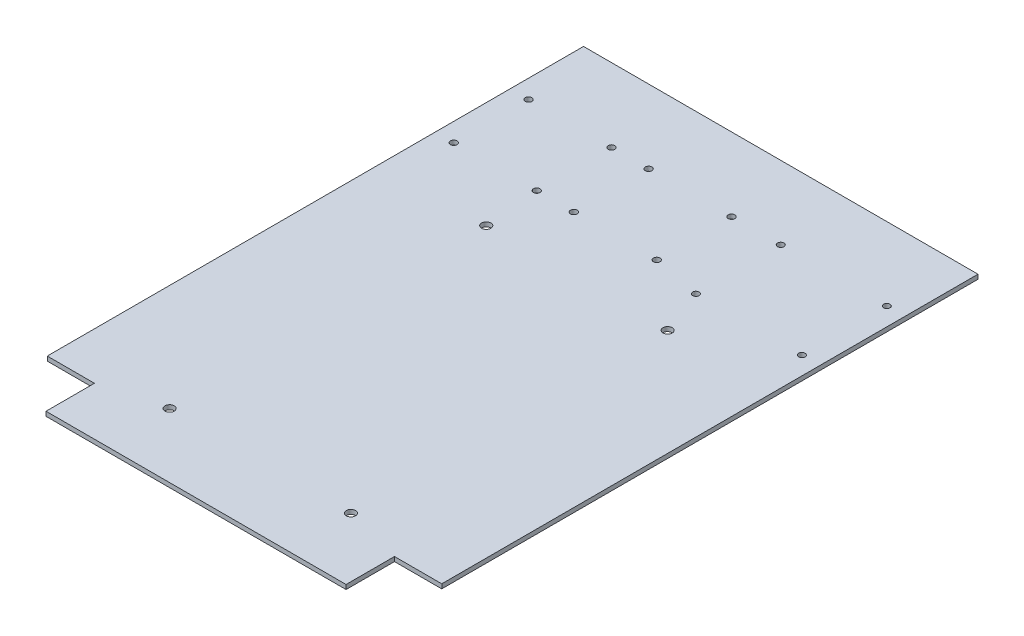
ISO-10303-21;
HEADER;
FILE_DESCRIPTION(('STEP AP214'),'2;1');
FILE_NAME('part.step','',(''),(''),'','','');
FILE_SCHEMA(('AUTOMOTIVE_DESIGN { 1 0 10303 214 1 1 1 1 }'));
ENDSEC;
DATA;
#1=APPLICATION_CONTEXT('core data for automotive mechanical design processes');
#2=APPLICATION_PROTOCOL_DEFINITION('international standard','automotive_design',2000,#1);
#3=PRODUCT_CONTEXT('',#1,'mechanical');
#4=PRODUCT('Part','Part','',(#3));
#5=PRODUCT_RELATED_PRODUCT_CATEGORY('part','',(#4));
#6=PRODUCT_DEFINITION_FORMATION('','',#4);
#7=PRODUCT_DEFINITION_CONTEXT('part definition',#1,'design');
#8=PRODUCT_DEFINITION('design','',#6,#7);
#9=PRODUCT_DEFINITION_SHAPE('','',#8);
#10=(LENGTH_UNIT() NAMED_UNIT(*) SI_UNIT(.MILLI.,.METRE.));
#11=(NAMED_UNIT(*) PLANE_ANGLE_UNIT() SI_UNIT($,.RADIAN.));
#12=(NAMED_UNIT(*) SI_UNIT($,.STERADIAN.) SOLID_ANGLE_UNIT());
#13=UNCERTAINTY_MEASURE_WITH_UNIT(LENGTH_MEASURE(1.E-05),#10,'distance_accuracy_value','');
#14=(GEOMETRIC_REPRESENTATION_CONTEXT(3) GLOBAL_UNCERTAINTY_ASSIGNED_CONTEXT((#13)) GLOBAL_UNIT_ASSIGNED_CONTEXT((#10,
#11,#12)) REPRESENTATION_CONTEXT('',''));
#15=CARTESIAN_POINT('',(0.,0.,0.));
#16=DIRECTION('',(0.,0.,1.));
#17=DIRECTION('',(1.,0.,0.));
#18=AXIS2_PLACEMENT_3D('',#15,#16,#17);
#19=CARTESIAN_POINT('',(-113.538,2.54,176.2125));
#20=DIRECTION('',(1.,0.,0.));
#21=DIRECTION('',(0.,0.,-1.));
#22=AXIS2_PLACEMENT_3D('',#19,#20,#21);
#23=PLANE('',#22);
#24=DIRECTION('',(0.,0.,1.));
#25=VECTOR('',#24,1.);
#26=CARTESIAN_POINT('',(-113.538,0.,176.2125));
#27=LINE('',#26,#25);
#28=CARTESIAN_POINT('',(-113.538,0.,-176.2125));
#29=VERTEX_POINT('',#28);
#30=CARTESIAN_POINT('',(-113.538,0.,132.460999999996));
#31=VERTEX_POINT('',#30);
#32=EDGE_CURVE('E256',#29,#31,#27,.T.);
#33=ORIENTED_EDGE('',*,*,#32,.T.);
#34=DIRECTION('',(0.,1.,0.));
#35=VECTOR('',#34,1.);
#36=CARTESIAN_POINT('',(-113.538,2.54,132.460999999996));
#37=LINE('',#36,#35);
#38=CARTESIAN_POINT('',(-113.538,2.54,132.460999999996));
#39=VERTEX_POINT('',#38);
#40=EDGE_CURVE('E251',#31,#39,#37,.T.);
#41=ORIENTED_EDGE('',*,*,#40,.T.);
#42=DIRECTION('',(0.,0.,1.));
#43=VECTOR('',#42,1.);
#44=CARTESIAN_POINT('',(-113.538,2.54,176.2125));
#45=LINE('',#44,#43);
#46=CARTESIAN_POINT('',(-113.538,2.54,-176.2125));
#47=VERTEX_POINT('',#46);
#48=EDGE_CURVE('E257',#47,#39,#45,.T.);
#49=ORIENTED_EDGE('',*,*,#48,.F.);
#50=DIRECTION('',(0.,-1.,0.));
#51=VECTOR('',#50,1.);
#52=CARTESIAN_POINT('',(-113.538,2.54,-176.2125));
#53=LINE('',#52,#51);
#54=EDGE_CURVE('E267',#47,#29,#53,.T.);
#55=ORIENTED_EDGE('',*,*,#54,.T.);
#56=EDGE_LOOP('',(#33,#41,#49,#55));
#57=FACE_BOUND('',#56,.T.);
#58=ADVANCED_FACE('F43',(#57),#23,.F.);
#59=CARTESIAN_POINT('',(113.538,2.54,176.2125));
#60=DIRECTION('',(-1.,0.,0.));
#61=DIRECTION('',(0.,0.,1.));
#62=AXIS2_PLACEMENT_3D('',#59,#60,#61);
#63=PLANE('',#62);
#64=DIRECTION('',(0.,0.,-1.));
#65=VECTOR('',#64,1.);
#66=CARTESIAN_POINT('',(113.538,2.54,176.2125));
#67=LINE('',#66,#65);
#68=CARTESIAN_POINT('',(113.538,2.54,132.460999999996));
#69=VERTEX_POINT('',#68);
#70=CARTESIAN_POINT('',(113.538,2.54,-176.2125));
#71=VERTEX_POINT('',#70);
#72=EDGE_CURVE('E261',#69,#71,#67,.T.);
#73=ORIENTED_EDGE('',*,*,#72,.F.);
#74=DIRECTION('',(0.,-1.,0.));
#75=VECTOR('',#74,1.);
#76=CARTESIAN_POINT('',(113.538,2.54,132.460999999996));
#77=LINE('',#76,#75);
#78=CARTESIAN_POINT('',(113.538,0.,132.460999999996));
#79=VERTEX_POINT('',#78);
#80=EDGE_CURVE('E114',#69,#79,#77,.T.);
#81=ORIENTED_EDGE('',*,*,#80,.T.);
#82=DIRECTION('',(0.,0.,-1.));
#83=VECTOR('',#82,1.);
#84=CARTESIAN_POINT('',(113.538,0.,176.2125));
#85=LINE('',#84,#83);
#86=CARTESIAN_POINT('',(113.538,0.,-176.2125));
#87=VERTEX_POINT('',#86);
#88=EDGE_CURVE('E125',#79,#87,#85,.T.);
#89=ORIENTED_EDGE('',*,*,#88,.T.);
#90=DIRECTION('',(0.,-1.,0.));
#91=VECTOR('',#90,1.);
#92=CARTESIAN_POINT('',(113.538,2.54,-176.2125));
#93=LINE('',#92,#91);
#94=EDGE_CURVE('E277',#71,#87,#93,.T.);
#95=ORIENTED_EDGE('',*,*,#94,.F.);
#96=EDGE_LOOP('',(#73,#81,#89,#95));
#97=FACE_BOUND('',#96,.T.);
#98=ADVANCED_FACE('F311',(#97),#63,.F.);
#99=CARTESIAN_POINT('',(113.538,2.54,-176.2125));
#100=DIRECTION('',(0.,0.,1.));
#101=DIRECTION('',(1.,0.,0.));
#102=AXIS2_PLACEMENT_3D('',#99,#100,#101);
#103=PLANE('',#102);
#104=DIRECTION('',(-1.,0.,0.));
#105=VECTOR('',#104,1.);
#106=CARTESIAN_POINT('',(113.538,0.,-176.2125));
#107=LINE('',#106,#105);
#108=EDGE_CURVE('E262',#87,#29,#107,.T.);
#109=ORIENTED_EDGE('',*,*,#108,.T.);
#110=ORIENTED_EDGE('',*,*,#54,.F.);
#111=DIRECTION('',(-1.,0.,0.));
#112=VECTOR('',#111,1.);
#113=CARTESIAN_POINT('',(113.538,2.54,-176.2125));
#114=LINE('',#113,#112);
#115=EDGE_CURVE('E265',#71,#47,#114,.T.);
#116=ORIENTED_EDGE('',*,*,#115,.F.);
#117=ORIENTED_EDGE('',*,*,#94,.T.);
#118=EDGE_LOOP('',(#109,#110,#116,#117));
#119=FACE_BOUND('',#118,.T.);
#120=ADVANCED_FACE('F315',(#119),#103,.F.);
#121=CARTESIAN_POINT('',(0.,2.54,0.));
#122=DIRECTION('',(0.,1.,0.));
#123=DIRECTION('',(0.,0.,1.));
#124=AXIS2_PLACEMENT_3D('',#121,#122,#123);
#125=PLANE('',#124);
#126=DIRECTION('',(0.,0.,1.));
#127=VECTOR('',#126,1.);
#128=CARTESIAN_POINT('',(86.3345999997772,2.54,173.505706146315));
#129=LINE('',#128,#127);
#130=CARTESIAN_POINT('',(86.3345999997772,2.54,132.460999999996));
#131=VERTEX_POINT('',#130);
#132=CARTESIAN_POINT('',(86.3345999997772,2.54,160.3375));
#133=VERTEX_POINT('',#132);
#134=EDGE_CURVE('E57',#131,#133,#129,.T.);
#135=ORIENTED_EDGE('',*,*,#134,.F.);
#136=DIRECTION('',(-1.,0.,0.));
#137=VECTOR('',#136,1.);
#138=CARTESIAN_POINT('',(116.814599999777,2.54,132.460999999996));
#139=LINE('',#138,#137);
#140=EDGE_CURVE('E113',#69,#131,#139,.T.);
#141=ORIENTED_EDGE('',*,*,#140,.F.);
#142=ORIENTED_EDGE('',*,*,#72,.T.);
#143=ORIENTED_EDGE('',*,*,#115,.T.);
#144=ORIENTED_EDGE('',*,*,#48,.T.);
#145=DIRECTION('',(-1.,0.,0.));
#146=VECTOR('',#145,1.);
#147=CARTESIAN_POINT('',(-116.865400000223,2.54,132.460999999996));
#148=LINE('',#147,#146);
#149=CARTESIAN_POINT('',(-86.3854000002228,2.54,132.460999999996));
#150=VERTEX_POINT('',#149);
#151=EDGE_CURVE('E236',#150,#39,#148,.T.);
#152=ORIENTED_EDGE('',*,*,#151,.F.);
#153=DIRECTION('',(0.,0.,-1.));
#154=VECTOR('',#153,1.);
#155=CARTESIAN_POINT('',(-86.3854000002228,2.54,132.460999999996));
#156=LINE('',#155,#154);
#157=CARTESIAN_POINT('',(-86.3854000002228,2.54,160.3375));
#158=VERTEX_POINT('',#157);
#159=EDGE_CURVE('E237',#158,#150,#156,.T.);
#160=ORIENTED_EDGE('',*,*,#159,.F.);
#161=DIRECTION('',(-1.,0.,0.));
#162=VECTOR('',#161,1.);
#163=CARTESIAN_POINT('',(0.,2.54,160.3375));
#164=LINE('',#163,#162);
#165=EDGE_CURVE('E63',#133,#158,#164,.T.);
#166=ORIENTED_EDGE('',*,*,#165,.F.);
#167=EDGE_LOOP('',(#135,#141,#142,#143,#144,#152,#160,#166));
#168=FACE_BOUND('',#167,.T.);
#169=CARTESIAN_POINT('',(-55.1204042675425,2.54,-133.922560256874));
#170=DIRECTION('',(0.,1.,0.));
#171=DIRECTION('',(0.,0.,1.));
#172=AXIS2_PLACEMENT_3D('',#169,#170,#171);
#173=CIRCLE('',#172,1.905);
#174=CARTESIAN_POINT('',(-55.1204042675425,2.54,-132.017560256874));
#175=VERTEX_POINT('',#174);
#176=EDGE_CURVE('E138',#175,#175,#173,.T.);
#177=ORIENTED_EDGE('',*,*,#176,.F.);
#178=EDGE_LOOP('',(#177));
#179=FACE_BOUND('',#178,.T.);
#180=CARTESIAN_POINT('',(-102.870050800407,2.54,-133.922560256874));
#181=DIRECTION('',(0.,1.,0.));
#182=DIRECTION('',(0.,0.,1.));
#183=AXIS2_PLACEMENT_3D('',#180,#181,#182);
#184=CIRCLE('',#183,1.905);
#185=CARTESIAN_POINT('',(-102.870050800407,2.54,-132.017560256874));
#186=VERTEX_POINT('',#185);
#187=EDGE_CURVE('E208',#186,#186,#184,.T.);
#188=ORIENTED_EDGE('',*,*,#187,.F.);
#189=EDGE_LOOP('',(#188));
#190=FACE_BOUND('',#189,.T.);
#191=CARTESIAN_POINT('',(-102.870050800407,2.54,-90.8695602568742));
#192=DIRECTION('',(0.,1.,0.));
#193=DIRECTION('',(0.,0.,1.));
#194=AXIS2_PLACEMENT_3D('',#191,#192,#193);
#195=CIRCLE('',#194,1.90500000000001);
#196=CARTESIAN_POINT('',(-102.870050800407,2.54,-88.9645602568742));
#197=VERTEX_POINT('',#196);
#198=EDGE_CURVE('E202',#197,#197,#195,.T.);
#199=ORIENTED_EDGE('',*,*,#198,.F.);
#200=EDGE_LOOP('',(#199));
#201=FACE_BOUND('',#200,.T.);
#202=CARTESIAN_POINT('',(-55.118050800407,2.54,-90.8695602568742));
#203=DIRECTION('',(0.,1.,0.));
#204=DIRECTION('',(0.,0.,1.));
#205=AXIS2_PLACEMENT_3D('',#202,#203,#204);
#206=CIRCLE('',#205,1.905);
#207=CARTESIAN_POINT('',(-55.118050800407,2.54,-88.9645602568742));
#208=VERTEX_POINT('',#207);
#209=EDGE_CURVE('E195',#208,#208,#206,.T.);
#210=ORIENTED_EDGE('',*,*,#209,.F.);
#211=EDGE_LOOP('',(#210));
#212=FACE_BOUND('',#211,.T.);
#213=CARTESIAN_POINT('',(-33.7820508004074,2.54,-133.922560256874));
#214=DIRECTION('',(0.,1.,0.));
#215=DIRECTION('',(0.,0.,1.));
#216=AXIS2_PLACEMENT_3D('',#213,#214,#215);
#217=CIRCLE('',#216,1.905);
#218=CARTESIAN_POINT('',(-33.7820508004074,2.54,-132.017560256874));
#219=VERTEX_POINT('',#218);
#220=EDGE_CURVE('E220',#219,#219,#217,.T.);
#221=ORIENTED_EDGE('',*,*,#220,.F.);
#222=EDGE_LOOP('',(#221));
#223=FACE_BOUND('',#222,.T.);
#224=CARTESIAN_POINT('',(-33.7820508004074,2.54,-90.8695602568743));
#225=DIRECTION('',(0.,1.,0.));
#226=DIRECTION('',(0.,0.,1.));
#227=AXIS2_PLACEMENT_3D('',#224,#225,#226);
#228=CIRCLE('',#227,1.905);
#229=CARTESIAN_POINT('',(-33.7820508004074,2.54,-88.9645602568743));
#230=VERTEX_POINT('',#229);
#231=EDGE_CURVE('E221',#230,#230,#228,.T.);
#232=ORIENTED_EDGE('',*,*,#231,.F.);
#233=EDGE_LOOP('',(#232));
#234=FACE_BOUND('',#233,.T.);
#235=CARTESIAN_POINT('',(13.9699491995926,2.54,-90.8695602568743));
#236=DIRECTION('',(0.,1.,0.));
#237=DIRECTION('',(0.,0.,1.));
#238=AXIS2_PLACEMENT_3D('',#235,#236,#237);
#239=CIRCLE('',#238,1.90500000000001);
#240=CARTESIAN_POINT('',(13.9699491995926,2.54,-88.9645602568743));
#241=VERTEX_POINT('',#240);
#242=EDGE_CURVE('E194',#241,#241,#239,.T.);
#243=ORIENTED_EDGE('',*,*,#242,.F.);
#244=EDGE_LOOP('',(#243));
#245=FACE_BOUND('',#244,.T.);
#246=CARTESIAN_POINT('',(42.1259507999995,2.54,-134.087660257276));
#247=DIRECTION('',(0.,1.,0.));
#248=DIRECTION('',(0.,0.,1.));
#249=AXIS2_PLACEMENT_3D('',#246,#247,#248);
#250=CIRCLE('',#249,1.83872447278816);
#251=CARTESIAN_POINT('',(42.1259507999995,2.54,-132.248935784488));
#252=VERTEX_POINT('',#251);
#253=EDGE_CURVE('E139',#252,#252,#250,.T.);
#254=ORIENTED_EDGE('',*,*,#253,.F.);
#255=EDGE_LOOP('',(#254));
#256=FACE_BOUND('',#255,.T.);
#257=CARTESIAN_POINT('',(103.162150799999,2.54,-134.087660257276));
#258=DIRECTION('',(0.,1.,0.));
#259=DIRECTION('',(0.,0.,1.));
#260=AXIS2_PLACEMENT_3D('',#257,#258,#259);
#261=CIRCLE('',#260,1.83872447278816);
#262=CARTESIAN_POINT('',(103.162150799999,2.54,-132.248935784488));
#263=VERTEX_POINT('',#262);
#264=EDGE_CURVE('E145',#263,#263,#261,.T.);
#265=ORIENTED_EDGE('',*,*,#264,.F.);
#266=EDGE_LOOP('',(#265));
#267=FACE_BOUND('',#266,.T.);
#268=CARTESIAN_POINT('',(103.162150799999,2.54,-85.2434602572759));
#269=DIRECTION('',(0.,1.,0.));
#270=DIRECTION('',(0.,0.,1.));
#271=AXIS2_PLACEMENT_3D('',#268,#269,#270);
#272=CIRCLE('',#271,1.83872447278816);
#273=CARTESIAN_POINT('',(103.162150799999,2.54,-83.4047357844877));
#274=VERTEX_POINT('',#273);
#275=EDGE_CURVE('E151',#274,#274,#272,.T.);
#276=ORIENTED_EDGE('',*,*,#275,.F.);
#277=EDGE_LOOP('',(#276));
#278=FACE_BOUND('',#277,.T.);
#279=CARTESIAN_POINT('',(42.1259507999995,2.54,-85.2434602572759));
#280=DIRECTION('',(0.,1.,0.));
#281=DIRECTION('',(0.,0.,1.));
#282=AXIS2_PLACEMENT_3D('',#279,#280,#281);
#283=CIRCLE('',#282,1.83872447278816);
#284=CARTESIAN_POINT('',(42.1259507999995,2.54,-83.4047357844877));
#285=VERTEX_POINT('',#284);
#286=EDGE_CURVE('E159',#285,#285,#283,.T.);
#287=ORIENTED_EDGE('',*,*,#286,.F.);
#288=EDGE_LOOP('',(#287));
#289=FACE_BOUND('',#288,.T.);
#290=CARTESIAN_POINT('',(52.1969999997947,2.54,-58.8853890367552));
#291=DIRECTION('',(0.,1.,0.));
#292=DIRECTION('',(0.,0.,1.));
#293=AXIS2_PLACEMENT_3D('',#290,#291,#292);
#294=CIRCLE('',#293,2.667);
#295=CARTESIAN_POINT('',(52.1969999997947,2.54,-56.2183890367552));
#296=VERTEX_POINT('',#295);
#297=EDGE_CURVE('E167',#296,#296,#294,.T.);
#298=ORIENTED_EDGE('',*,*,#297,.F.);
#299=EDGE_LOOP('',(#298));
#300=FACE_BOUND('',#299,.T.);
#301=CARTESIAN_POINT('',(-52.1970000002053,2.54,-58.8853890367553));
#302=DIRECTION('',(0.,1.,0.));
#303=DIRECTION('',(0.,0.,1.));
#304=AXIS2_PLACEMENT_3D('',#301,#302,#303);
#305=CIRCLE('',#304,2.667);
#306=CARTESIAN_POINT('',(-52.1970000002053,2.54,-56.2183890367553));
#307=VERTEX_POINT('',#306);
#308=EDGE_CURVE('E175',#307,#307,#305,.T.);
#309=ORIENTED_EDGE('',*,*,#308,.F.);
#310=EDGE_LOOP('',(#309));
#311=FACE_BOUND('',#310,.T.);
#312=CARTESIAN_POINT('',(52.1969999997946,2.54,123.385010963245));
#313=DIRECTION('',(0.,1.,0.));
#314=DIRECTION('',(0.,0.,1.));
#315=AXIS2_PLACEMENT_3D('',#312,#313,#314);
#316=CIRCLE('',#315,2.667);
#317=CARTESIAN_POINT('',(52.1969999997946,2.54,126.052010963245));
#318=VERTEX_POINT('',#317);
#319=EDGE_CURVE('E182',#318,#318,#316,.T.);
#320=ORIENTED_EDGE('',*,*,#319,.F.);
#321=EDGE_LOOP('',(#320));
#322=FACE_BOUND('',#321,.T.);
#323=CARTESIAN_POINT('',(-52.1970000002054,2.54,123.385010963245));
#324=DIRECTION('',(0.,1.,0.));
#325=DIRECTION('',(0.,0.,1.));
#326=AXIS2_PLACEMENT_3D('',#323,#324,#325);
#327=CIRCLE('',#326,2.667);
#328=CARTESIAN_POINT('',(-52.1970000002054,2.54,126.052010963245));
#329=VERTEX_POINT('',#328);
#330=EDGE_CURVE('E134',#329,#329,#327,.T.);
#331=ORIENTED_EDGE('',*,*,#330,.F.);
#332=EDGE_LOOP('',(#331));
#333=FACE_BOUND('',#332,.T.);
#334=CARTESIAN_POINT('',(13.9675957324571,2.54,-133.922560256874));
#335=DIRECTION('',(0.,1.,0.));
#336=DIRECTION('',(0.,0.,1.));
#337=AXIS2_PLACEMENT_3D('',#334,#335,#336);
#338=CIRCLE('',#337,1.90499999999999);
#339=CARTESIAN_POINT('',(13.9675957324571,2.54,-132.017560256874));
#340=VERTEX_POINT('',#339);
#341=EDGE_CURVE('E243',#340,#340,#338,.T.);
#342=ORIENTED_EDGE('',*,*,#341,.F.);
#343=EDGE_LOOP('',(#342));
#344=FACE_BOUND('',#343,.T.);
#345=ADVANCED_FACE('F288',(#168,#179,#190,#201,#212,#223,#234,#245,#256,#267,#278,#289,#300,
#311,#322,#333,#344),#125,.T.);
#346=CARTESIAN_POINT('',(0.,0.,0.));
#347=DIRECTION('',(0.,1.,0.));
#348=DIRECTION('',(0.,0.,1.));
#349=AXIS2_PLACEMENT_3D('',#346,#347,#348);
#350=PLANE('',#349);
#351=CARTESIAN_POINT('',(-55.1204042675425,0.,-133.922560256874));
#352=DIRECTION('',(0.,1.,0.));
#353=DIRECTION('',(0.,0.,1.));
#354=AXIS2_PLACEMENT_3D('',#351,#352,#353);
#355=CIRCLE('',#354,1.905);
#356=CARTESIAN_POINT('',(-55.1204042675425,0.,-132.017560256874));
#357=VERTEX_POINT('',#356);
#358=EDGE_CURVE('E211',#357,#357,#355,.T.);
#359=ORIENTED_EDGE('',*,*,#358,.T.);
#360=EDGE_LOOP('',(#359));
#361=FACE_BOUND('',#360,.T.);
#362=CARTESIAN_POINT('',(-102.870050800407,0.,-133.922560256874));
#363=DIRECTION('',(0.,1.,0.));
#364=DIRECTION('',(0.,0.,1.));
#365=AXIS2_PLACEMENT_3D('',#362,#363,#364);
#366=CIRCLE('',#365,1.905);
#367=CARTESIAN_POINT('',(-102.870050800407,0.,-132.017560256874));
#368=VERTEX_POINT('',#367);
#369=EDGE_CURVE('E205',#368,#368,#366,.T.);
#370=ORIENTED_EDGE('',*,*,#369,.T.);
#371=EDGE_LOOP('',(#370));
#372=FACE_BOUND('',#371,.T.);
#373=CARTESIAN_POINT('',(-102.870050800407,0.,-90.8695602568742));
#374=DIRECTION('',(0.,1.,0.));
#375=DIRECTION('',(0.,0.,1.));
#376=AXIS2_PLACEMENT_3D('',#373,#374,#375);
#377=CIRCLE('',#376,1.90500000000001);
#378=CARTESIAN_POINT('',(-102.870050800407,0.,-88.9645602568742));
#379=VERTEX_POINT('',#378);
#380=EDGE_CURVE('E199',#379,#379,#377,.T.);
#381=ORIENTED_EDGE('',*,*,#380,.T.);
#382=EDGE_LOOP('',(#381));
#383=FACE_BOUND('',#382,.T.);
#384=CARTESIAN_POINT('',(-55.118050800407,0.,-90.8695602568742));
#385=DIRECTION('',(0.,1.,0.));
#386=DIRECTION('',(0.,0.,1.));
#387=AXIS2_PLACEMENT_3D('',#384,#385,#386);
#388=CIRCLE('',#387,1.905);
#389=CARTESIAN_POINT('',(-55.118050800407,0.,-88.9645602568742));
#390=VERTEX_POINT('',#389);
#391=EDGE_CURVE('E190',#390,#390,#388,.T.);
#392=ORIENTED_EDGE('',*,*,#391,.T.);
#393=EDGE_LOOP('',(#392));
#394=FACE_BOUND('',#393,.T.);
#395=CARTESIAN_POINT('',(-33.7820508004074,0.,-133.922560256874));
#396=DIRECTION('',(0.,1.,0.));
#397=DIRECTION('',(0.,0.,1.));
#398=AXIS2_PLACEMENT_3D('',#395,#396,#397);
#399=CIRCLE('',#398,1.905);
#400=CARTESIAN_POINT('',(-33.7820508004074,0.,-132.017560256874));
#401=VERTEX_POINT('',#400);
#402=EDGE_CURVE('E239',#401,#401,#399,.T.);
#403=ORIENTED_EDGE('',*,*,#402,.T.);
#404=EDGE_LOOP('',(#403));
#405=FACE_BOUND('',#404,.T.);
#406=CARTESIAN_POINT('',(-33.7820508004074,0.,-90.8695602568743));
#407=DIRECTION('',(0.,1.,0.));
#408=DIRECTION('',(0.,0.,1.));
#409=AXIS2_PLACEMENT_3D('',#406,#407,#408);
#410=CIRCLE('',#409,1.905);
#411=CARTESIAN_POINT('',(-33.7820508004074,0.,-88.9645602568743));
#412=VERTEX_POINT('',#411);
#413=EDGE_CURVE('E216',#412,#412,#410,.T.);
#414=ORIENTED_EDGE('',*,*,#413,.T.);
#415=EDGE_LOOP('',(#414));
#416=FACE_BOUND('',#415,.T.);
#417=CARTESIAN_POINT('',(13.9699491995926,0.,-90.8695602568743));
#418=DIRECTION('',(0.,1.,0.));
#419=DIRECTION('',(0.,0.,1.));
#420=AXIS2_PLACEMENT_3D('',#417,#418,#419);
#421=CIRCLE('',#420,1.90500000000001);
#422=CARTESIAN_POINT('',(13.9699491995926,0.,-88.9645602568743));
#423=VERTEX_POINT('',#422);
#424=EDGE_CURVE('E225',#423,#423,#421,.T.);
#425=ORIENTED_EDGE('',*,*,#424,.T.);
#426=EDGE_LOOP('',(#425));
#427=FACE_BOUND('',#426,.T.);
#428=CARTESIAN_POINT('',(42.1259507999995,0.,-134.087660257276));
#429=DIRECTION('',(0.,1.,0.));
#430=DIRECTION('',(0.,0.,1.));
#431=AXIS2_PLACEMENT_3D('',#428,#429,#430);
#432=CIRCLE('',#431,1.83872447278816);
#433=CARTESIAN_POINT('',(42.1259507999995,0.,-132.248935784488));
#434=VERTEX_POINT('',#433);
#435=EDGE_CURVE('E135',#434,#434,#432,.T.);
#436=ORIENTED_EDGE('',*,*,#435,.T.);
#437=EDGE_LOOP('',(#436));
#438=FACE_BOUND('',#437,.T.);
#439=CARTESIAN_POINT('',(103.162150799999,0.,-134.087660257276));
#440=DIRECTION('',(0.,1.,0.));
#441=DIRECTION('',(0.,0.,1.));
#442=AXIS2_PLACEMENT_3D('',#439,#440,#441);
#443=CIRCLE('',#442,1.83872447278816);
#444=CARTESIAN_POINT('',(103.162150799999,0.,-132.248935784488));
#445=VERTEX_POINT('',#444);
#446=EDGE_CURVE('E142',#445,#445,#443,.T.);
#447=ORIENTED_EDGE('',*,*,#446,.T.);
#448=EDGE_LOOP('',(#447));
#449=FACE_BOUND('',#448,.T.);
#450=CARTESIAN_POINT('',(103.162150799999,0.,-85.2434602572759));
#451=DIRECTION('',(0.,1.,0.));
#452=DIRECTION('',(0.,0.,1.));
#453=AXIS2_PLACEMENT_3D('',#450,#451,#452);
#454=CIRCLE('',#453,1.83872447278816);
#455=CARTESIAN_POINT('',(103.162150799999,0.,-83.4047357844877));
#456=VERTEX_POINT('',#455);
#457=EDGE_CURVE('E148',#456,#456,#454,.T.);
#458=ORIENTED_EDGE('',*,*,#457,.T.);
#459=EDGE_LOOP('',(#458));
#460=FACE_BOUND('',#459,.T.);
#461=CARTESIAN_POINT('',(42.1259507999995,0.,-85.2434602572759));
#462=DIRECTION('',(0.,1.,0.));
#463=DIRECTION('',(0.,0.,1.));
#464=AXIS2_PLACEMENT_3D('',#461,#462,#463);
#465=CIRCLE('',#464,1.83872447278816);
#466=CARTESIAN_POINT('',(42.1259507999995,0.,-83.4047357844877));
#467=VERTEX_POINT('',#466);
#468=EDGE_CURVE('E155',#467,#467,#465,.T.);
#469=ORIENTED_EDGE('',*,*,#468,.T.);
#470=EDGE_LOOP('',(#469));
#471=FACE_BOUND('',#470,.T.);
#472=CARTESIAN_POINT('',(52.1969999997947,0.,-58.8853890367552));
#473=DIRECTION('',(0.,1.,0.));
#474=DIRECTION('',(0.,0.,1.));
#475=AXIS2_PLACEMENT_3D('',#472,#473,#474);
#476=CIRCLE('',#475,2.667);
#477=CARTESIAN_POINT('',(52.1969999997947,0.,-56.2183890367552));
#478=VERTEX_POINT('',#477);
#479=EDGE_CURVE('E163',#478,#478,#476,.T.);
#480=ORIENTED_EDGE('',*,*,#479,.T.);
#481=EDGE_LOOP('',(#480));
#482=FACE_BOUND('',#481,.T.);
#483=CARTESIAN_POINT('',(-52.1970000002053,0.,-58.8853890367553));
#484=DIRECTION('',(0.,1.,0.));
#485=DIRECTION('',(0.,0.,1.));
#486=AXIS2_PLACEMENT_3D('',#483,#484,#485);
#487=CIRCLE('',#486,2.667);
#488=CARTESIAN_POINT('',(-52.1970000002053,0.,-56.2183890367553));
#489=VERTEX_POINT('',#488);
#490=EDGE_CURVE('E171',#489,#489,#487,.T.);
#491=ORIENTED_EDGE('',*,*,#490,.T.);
#492=EDGE_LOOP('',(#491));
#493=FACE_BOUND('',#492,.T.);
#494=CARTESIAN_POINT('',(52.1969999997946,0.,123.385010963245));
#495=DIRECTION('',(0.,1.,0.));
#496=DIRECTION('',(0.,0.,1.));
#497=AXIS2_PLACEMENT_3D('',#494,#495,#496);
#498=CIRCLE('',#497,2.667);
#499=CARTESIAN_POINT('',(52.1969999997946,0.,126.052010963245));
#500=VERTEX_POINT('',#499);
#501=EDGE_CURVE('E179',#500,#500,#498,.T.);
#502=ORIENTED_EDGE('',*,*,#501,.T.);
#503=EDGE_LOOP('',(#502));
#504=FACE_BOUND('',#503,.T.);
#505=CARTESIAN_POINT('',(-52.1970000002054,0.,123.385010963245));
#506=DIRECTION('',(0.,1.,0.));
#507=DIRECTION('',(0.,0.,1.));
#508=AXIS2_PLACEMENT_3D('',#505,#506,#507);
#509=CIRCLE('',#508,2.667);
#510=CARTESIAN_POINT('',(-52.1970000002054,0.,126.052010963245));
#511=VERTEX_POINT('',#510);
#512=EDGE_CURVE('E185',#511,#511,#509,.T.);
#513=ORIENTED_EDGE('',*,*,#512,.T.);
#514=EDGE_LOOP('',(#513));
#515=FACE_BOUND('',#514,.T.);
#516=CARTESIAN_POINT('',(13.9675957324571,0.,-133.922560256874));
#517=DIRECTION('',(0.,1.,0.));
#518=DIRECTION('',(0.,0.,1.));
#519=AXIS2_PLACEMENT_3D('',#516,#517,#518);
#520=CIRCLE('',#519,1.90499999999999);
#521=CARTESIAN_POINT('',(13.9675957324571,0.,-132.017560256874));
#522=VERTEX_POINT('',#521);
#523=EDGE_CURVE('E248',#522,#522,#520,.T.);
#524=ORIENTED_EDGE('',*,*,#523,.T.);
#525=EDGE_LOOP('',(#524));
#526=FACE_BOUND('',#525,.T.);
#527=DIRECTION('',(-1.,0.,0.));
#528=VECTOR('',#527,1.);
#529=CARTESIAN_POINT('',(116.814599999777,0.,132.460999999996));
#530=LINE('',#529,#528);
#531=CARTESIAN_POINT('',(86.3345999997772,0.,132.460999999996));
#532=VERTEX_POINT('',#531);
#533=EDGE_CURVE('E110',#79,#532,#530,.T.);
#534=ORIENTED_EDGE('',*,*,#533,.T.);
#535=DIRECTION('',(0.,0.,1.));
#536=VECTOR('',#535,1.);
#537=CARTESIAN_POINT('',(86.3345999997772,0.,173.505706146315));
#538=LINE('',#537,#536);
#539=CARTESIAN_POINT('',(86.3345999997772,0.,160.3375));
#540=VERTEX_POINT('',#539);
#541=EDGE_CURVE('E115',#532,#540,#538,.T.);
#542=ORIENTED_EDGE('',*,*,#541,.T.);
#543=DIRECTION('',(-1.,0.,0.));
#544=VECTOR('',#543,1.);
#545=CARTESIAN_POINT('',(0.,0.,160.3375));
#546=LINE('',#545,#544);
#547=CARTESIAN_POINT('',(-86.3854000002228,0.,160.3375));
#548=VERTEX_POINT('',#547);
#549=EDGE_CURVE('E131',#540,#548,#546,.T.);
#550=ORIENTED_EDGE('',*,*,#549,.T.);
#551=DIRECTION('',(0.,0.,-1.));
#552=VECTOR('',#551,1.);
#553=CARTESIAN_POINT('',(-86.3854000002228,0.,0.));
#554=LINE('',#553,#552);
#555=CARTESIAN_POINT('',(-86.3854000002228,0.,132.460999999996));
#556=VERTEX_POINT('',#555);
#557=EDGE_CURVE('E280',#548,#556,#554,.T.);
#558=ORIENTED_EDGE('',*,*,#557,.T.);
#559=DIRECTION('',(-1.,0.,0.));
#560=VECTOR('',#559,1.);
#561=CARTESIAN_POINT('',(-116.865400000223,0.,132.460999999996));
#562=LINE('',#561,#560);
#563=EDGE_CURVE('E232',#556,#31,#562,.T.);
#564=ORIENTED_EDGE('',*,*,#563,.T.);
#565=ORIENTED_EDGE('',*,*,#32,.F.);
#566=ORIENTED_EDGE('',*,*,#108,.F.);
#567=ORIENTED_EDGE('',*,*,#88,.F.);
#568=EDGE_LOOP('',(#534,#542,#550,#558,#564,#565,#566,#567));
#569=FACE_BOUND('',#568,.T.);
#570=ADVANCED_FACE('F123',(#361,#372,#383,#394,#405,#416,#427,#438,#449,#460,#471,#482,#493,
#504,#515,#526,#569),#350,.F.);
#571=CARTESIAN_POINT('',(13.9675957324571,0.,-133.922560256874));
#572=DIRECTION('',(0.,1.,0.));
#573=DIRECTION('',(0.,0.,1.));
#574=AXIS2_PLACEMENT_3D('',#571,#572,#573);
#575=CYLINDRICAL_SURFACE('',#574,1.90499999999999);
#576=ORIENTED_EDGE('',*,*,#523,.F.);
#577=EDGE_LOOP('',(#576));
#578=FACE_BOUND('',#577,.T.);
#579=ORIENTED_EDGE('',*,*,#341,.T.);
#580=EDGE_LOOP('',(#579));
#581=FACE_BOUND('',#580,.T.);
#582=ADVANCED_FACE('F326',(#578,#581),#575,.F.);
#583=CARTESIAN_POINT('',(-52.1970000002054,0.,123.385010963245));
#584=DIRECTION('',(0.,1.,0.));
#585=DIRECTION('',(0.,0.,1.));
#586=AXIS2_PLACEMENT_3D('',#583,#584,#585);
#587=CYLINDRICAL_SURFACE('',#586,2.667);
#588=ORIENTED_EDGE('',*,*,#512,.F.);
#589=EDGE_LOOP('',(#588));
#590=FACE_BOUND('',#589,.T.);
#591=ORIENTED_EDGE('',*,*,#330,.T.);
#592=EDGE_LOOP('',(#591));
#593=FACE_BOUND('',#592,.T.);
#594=ADVANCED_FACE('F332',(#590,#593),#587,.F.);
#595=CARTESIAN_POINT('',(52.1969999997946,0.,123.385010963245));
#596=DIRECTION('',(0.,1.,0.));
#597=DIRECTION('',(0.,0.,1.));
#598=AXIS2_PLACEMENT_3D('',#595,#596,#597);
#599=CYLINDRICAL_SURFACE('',#598,2.667);
#600=ORIENTED_EDGE('',*,*,#501,.F.);
#601=EDGE_LOOP('',(#600));
#602=FACE_BOUND('',#601,.T.);
#603=ORIENTED_EDGE('',*,*,#319,.T.);
#604=EDGE_LOOP('',(#603));
#605=FACE_BOUND('',#604,.T.);
#606=ADVANCED_FACE('F364',(#602,#605),#599,.F.);
#607=CARTESIAN_POINT('',(-52.1970000002053,0.,-58.8853890367553));
#608=DIRECTION('',(0.,1.,0.));
#609=DIRECTION('',(0.,0.,1.));
#610=AXIS2_PLACEMENT_3D('',#607,#608,#609);
#611=CYLINDRICAL_SURFACE('',#610,2.667);
#612=ORIENTED_EDGE('',*,*,#490,.F.);
#613=EDGE_LOOP('',(#612));
#614=FACE_BOUND('',#613,.T.);
#615=ORIENTED_EDGE('',*,*,#308,.T.);
#616=EDGE_LOOP('',(#615));
#617=FACE_BOUND('',#616,.T.);
#618=ADVANCED_FACE('F368',(#614,#617),#611,.F.);
#619=CARTESIAN_POINT('',(52.1969999997947,0.,-58.8853890367552));
#620=DIRECTION('',(0.,1.,0.));
#621=DIRECTION('',(0.,0.,1.));
#622=AXIS2_PLACEMENT_3D('',#619,#620,#621);
#623=CYLINDRICAL_SURFACE('',#622,2.667);
#624=ORIENTED_EDGE('',*,*,#479,.F.);
#625=EDGE_LOOP('',(#624));
#626=FACE_BOUND('',#625,.T.);
#627=ORIENTED_EDGE('',*,*,#297,.T.);
#628=EDGE_LOOP('',(#627));
#629=FACE_BOUND('',#628,.T.);
#630=ADVANCED_FACE('F372',(#626,#629),#623,.F.);
#631=CARTESIAN_POINT('',(42.1259507999995,0.,-85.2434602572759));
#632=DIRECTION('',(0.,1.,0.));
#633=DIRECTION('',(0.,0.,1.));
#634=AXIS2_PLACEMENT_3D('',#631,#632,#633);
#635=CYLINDRICAL_SURFACE('',#634,1.83872447278816);
#636=ORIENTED_EDGE('',*,*,#468,.F.);
#637=EDGE_LOOP('',(#636));
#638=FACE_BOUND('',#637,.T.);
#639=ORIENTED_EDGE('',*,*,#286,.T.);
#640=EDGE_LOOP('',(#639));
#641=FACE_BOUND('',#640,.T.);
#642=ADVANCED_FACE('F376',(#638,#641),#635,.F.);
#643=CARTESIAN_POINT('',(103.162150799999,0.,-85.2434602572759));
#644=DIRECTION('',(0.,1.,0.));
#645=DIRECTION('',(0.,0.,1.));
#646=AXIS2_PLACEMENT_3D('',#643,#644,#645);
#647=CYLINDRICAL_SURFACE('',#646,1.83872447278816);
#648=ORIENTED_EDGE('',*,*,#457,.F.);
#649=EDGE_LOOP('',(#648));
#650=FACE_BOUND('',#649,.T.);
#651=ORIENTED_EDGE('',*,*,#275,.T.);
#652=EDGE_LOOP('',(#651));
#653=FACE_BOUND('',#652,.T.);
#654=ADVANCED_FACE('F380',(#650,#653),#647,.F.);
#655=CARTESIAN_POINT('',(103.162150799999,0.,-134.087660257276));
#656=DIRECTION('',(0.,1.,0.));
#657=DIRECTION('',(0.,0.,1.));
#658=AXIS2_PLACEMENT_3D('',#655,#656,#657);
#659=CYLINDRICAL_SURFACE('',#658,1.83872447278816);
#660=ORIENTED_EDGE('',*,*,#446,.F.);
#661=EDGE_LOOP('',(#660));
#662=FACE_BOUND('',#661,.T.);
#663=ORIENTED_EDGE('',*,*,#264,.T.);
#664=EDGE_LOOP('',(#663));
#665=FACE_BOUND('',#664,.T.);
#666=ADVANCED_FACE('F384',(#662,#665),#659,.F.);
#667=CARTESIAN_POINT('',(42.1259507999995,0.,-134.087660257276));
#668=DIRECTION('',(0.,1.,0.));
#669=DIRECTION('',(0.,0.,1.));
#670=AXIS2_PLACEMENT_3D('',#667,#668,#669);
#671=CYLINDRICAL_SURFACE('',#670,1.83872447278816);
#672=ORIENTED_EDGE('',*,*,#435,.F.);
#673=EDGE_LOOP('',(#672));
#674=FACE_BOUND('',#673,.T.);
#675=ORIENTED_EDGE('',*,*,#253,.T.);
#676=EDGE_LOOP('',(#675));
#677=FACE_BOUND('',#676,.T.);
#678=ADVANCED_FACE('F347',(#674,#677),#671,.F.);
#679=CARTESIAN_POINT('',(13.9699491995926,0.,-90.8695602568743));
#680=DIRECTION('',(0.,1.,0.));
#681=DIRECTION('',(0.,0.,1.));
#682=AXIS2_PLACEMENT_3D('',#679,#680,#681);
#683=CYLINDRICAL_SURFACE('',#682,1.90500000000001);
#684=ORIENTED_EDGE('',*,*,#424,.F.);
#685=EDGE_LOOP('',(#684));
#686=FACE_BOUND('',#685,.T.);
#687=ORIENTED_EDGE('',*,*,#242,.T.);
#688=EDGE_LOOP('',(#687));
#689=FACE_BOUND('',#688,.T.);
#690=ADVANCED_FACE('F344',(#686,#689),#683,.F.);
#691=CARTESIAN_POINT('',(-33.7820508004074,0.,-90.8695602568743));
#692=DIRECTION('',(0.,1.,0.));
#693=DIRECTION('',(0.,0.,1.));
#694=AXIS2_PLACEMENT_3D('',#691,#692,#693);
#695=CYLINDRICAL_SURFACE('',#694,1.905);
#696=ORIENTED_EDGE('',*,*,#413,.F.);
#697=EDGE_LOOP('',(#696));
#698=FACE_BOUND('',#697,.T.);
#699=ORIENTED_EDGE('',*,*,#231,.T.);
#700=EDGE_LOOP('',(#699));
#701=FACE_BOUND('',#700,.T.);
#702=ADVANCED_FACE('F337',(#698,#701),#695,.F.);
#703=CARTESIAN_POINT('',(-33.7820508004074,0.,-133.922560256874));
#704=DIRECTION('',(0.,1.,0.));
#705=DIRECTION('',(0.,0.,1.));
#706=AXIS2_PLACEMENT_3D('',#703,#704,#705);
#707=CYLINDRICAL_SURFACE('',#706,1.905);
#708=ORIENTED_EDGE('',*,*,#402,.F.);
#709=EDGE_LOOP('',(#708));
#710=FACE_BOUND('',#709,.T.);
#711=ORIENTED_EDGE('',*,*,#220,.T.);
#712=EDGE_LOOP('',(#711));
#713=FACE_BOUND('',#712,.T.);
#714=ADVANCED_FACE('F334',(#710,#713),#707,.F.);
#715=CARTESIAN_POINT('',(-116.865400000223,0.,132.460999999996));
#716=DIRECTION('',(0.,0.,-1.));
#717=DIRECTION('',(-1.,0.,0.));
#718=AXIS2_PLACEMENT_3D('',#715,#716,#717);
#719=PLANE('',#718);
#720=ORIENTED_EDGE('',*,*,#563,.F.);
#721=DIRECTION('',(0.,1.,0.));
#722=VECTOR('',#721,1.);
#723=CARTESIAN_POINT('',(-86.3854000002228,0.,132.460999999996));
#724=LINE('',#723,#722);
#725=EDGE_CURVE('E235',#556,#150,#724,.T.);
#726=ORIENTED_EDGE('',*,*,#725,.T.);
#727=ORIENTED_EDGE('',*,*,#151,.T.);
#728=ORIENTED_EDGE('',*,*,#40,.F.);
#729=EDGE_LOOP('',(#720,#726,#727,#728));
#730=FACE_BOUND('',#729,.T.);
#731=ADVANCED_FACE('F293',(#730),#719,.F.);
#732=CARTESIAN_POINT('',(-86.3854000002228,0.,132.460999999996));
#733=DIRECTION('',(1.,0.,0.));
#734=DIRECTION('',(0.,0.,-1.));
#735=AXIS2_PLACEMENT_3D('',#732,#733,#734);
#736=PLANE('',#735);
#737=ORIENTED_EDGE('',*,*,#557,.F.);
#738=DIRECTION('',(0.,1.,0.));
#739=VECTOR('',#738,1.);
#740=CARTESIAN_POINT('',(-86.3854000002228,0.,160.3375));
#741=LINE('',#740,#739);
#742=EDGE_CURVE('E50',#548,#158,#741,.T.);
#743=ORIENTED_EDGE('',*,*,#742,.T.);
#744=ORIENTED_EDGE('',*,*,#159,.T.);
#745=ORIENTED_EDGE('',*,*,#725,.F.);
#746=EDGE_LOOP('',(#737,#743,#744,#745));
#747=FACE_BOUND('',#746,.T.);
#748=ADVANCED_FACE('F284',(#747),#736,.F.);
#749=CARTESIAN_POINT('',(-55.118050800407,0.,-90.8695602568742));
#750=DIRECTION('',(0.,1.,0.));
#751=DIRECTION('',(0.,0.,1.));
#752=AXIS2_PLACEMENT_3D('',#749,#750,#751);
#753=CYLINDRICAL_SURFACE('',#752,1.905);
#754=ORIENTED_EDGE('',*,*,#391,.F.);
#755=EDGE_LOOP('',(#754));
#756=FACE_BOUND('',#755,.T.);
#757=ORIENTED_EDGE('',*,*,#209,.T.);
#758=EDGE_LOOP('',(#757));
#759=FACE_BOUND('',#758,.T.);
#760=ADVANCED_FACE('F341',(#756,#759),#753,.F.);
#761=CARTESIAN_POINT('',(-102.870050800407,0.,-90.8695602568742));
#762=DIRECTION('',(0.,1.,0.));
#763=DIRECTION('',(0.,0.,1.));
#764=AXIS2_PLACEMENT_3D('',#761,#762,#763);
#765=CYLINDRICAL_SURFACE('',#764,1.90500000000001);
#766=ORIENTED_EDGE('',*,*,#380,.F.);
#767=EDGE_LOOP('',(#766));
#768=FACE_BOUND('',#767,.T.);
#769=ORIENTED_EDGE('',*,*,#198,.T.);
#770=EDGE_LOOP('',(#769));
#771=FACE_BOUND('',#770,.T.);
#772=ADVANCED_FACE('F354',(#768,#771),#765,.F.);
#773=CARTESIAN_POINT('',(-102.870050800407,0.,-133.922560256874));
#774=DIRECTION('',(0.,1.,0.));
#775=DIRECTION('',(0.,0.,1.));
#776=AXIS2_PLACEMENT_3D('',#773,#774,#775);
#777=CYLINDRICAL_SURFACE('',#776,1.905);
#778=ORIENTED_EDGE('',*,*,#369,.F.);
#779=EDGE_LOOP('',(#778));
#780=FACE_BOUND('',#779,.T.);
#781=ORIENTED_EDGE('',*,*,#187,.T.);
#782=EDGE_LOOP('',(#781));
#783=FACE_BOUND('',#782,.T.);
#784=ADVANCED_FACE('F306',(#780,#783),#777,.F.);
#785=CARTESIAN_POINT('',(-55.1204042675425,0.,-133.922560256874));
#786=DIRECTION('',(0.,1.,0.));
#787=DIRECTION('',(0.,0.,1.));
#788=AXIS2_PLACEMENT_3D('',#785,#786,#787);
#789=CYLINDRICAL_SURFACE('',#788,1.905);
#790=ORIENTED_EDGE('',*,*,#358,.F.);
#791=EDGE_LOOP('',(#790));
#792=FACE_BOUND('',#791,.T.);
#793=ORIENTED_EDGE('',*,*,#176,.T.);
#794=EDGE_LOOP('',(#793));
#795=FACE_BOUND('',#794,.T.);
#796=ADVANCED_FACE('F299',(#792,#795),#789,.F.);
#797=CARTESIAN_POINT('',(0.,0.,160.3375));
#798=DIRECTION('',(0.,0.,-1.));
#799=DIRECTION('',(0.,1.,0.));
#800=AXIS2_PLACEMENT_3D('',#797,#798,#799);
#801=PLANE('',#800);
#802=ORIENTED_EDGE('',*,*,#549,.F.);
#803=DIRECTION('',(0.,1.,0.));
#804=VECTOR('',#803,1.);
#805=CARTESIAN_POINT('',(86.3345999997772,0.,160.3375));
#806=LINE('',#805,#804);
#807=EDGE_CURVE('E12',#540,#133,#806,.T.);
#808=ORIENTED_EDGE('',*,*,#807,.T.);
#809=ORIENTED_EDGE('',*,*,#165,.T.);
#810=ORIENTED_EDGE('',*,*,#742,.F.);
#811=EDGE_LOOP('',(#802,#808,#809,#810));
#812=FACE_BOUND('',#811,.T.);
#813=ADVANCED_FACE('F297',(#812),#801,.F.);
#814=CARTESIAN_POINT('',(116.814599999777,0.,132.460999999996));
#815=DIRECTION('',(0.,0.,-1.));
#816=DIRECTION('',(-1.,0.,0.));
#817=AXIS2_PLACEMENT_3D('',#814,#815,#816);
#818=PLANE('',#817);
#819=ORIENTED_EDGE('',*,*,#140,.T.);
#820=DIRECTION('',(0.,1.,0.));
#821=VECTOR('',#820,1.);
#822=CARTESIAN_POINT('',(86.3345999997772,0.,132.460999999996));
#823=LINE('',#822,#821);
#824=EDGE_CURVE('E106',#532,#131,#823,.T.);
#825=ORIENTED_EDGE('',*,*,#824,.F.);
#826=ORIENTED_EDGE('',*,*,#533,.F.);
#827=ORIENTED_EDGE('',*,*,#80,.F.);
#828=EDGE_LOOP('',(#819,#825,#826,#827));
#829=FACE_BOUND('',#828,.T.);
#830=ADVANCED_FACE('F108',(#829),#818,.F.);
#831=CARTESIAN_POINT('',(86.3345999997772,0.,173.505706146315));
#832=DIRECTION('',(-1.,0.,0.));
#833=DIRECTION('',(0.,0.,1.));
#834=AXIS2_PLACEMENT_3D('',#831,#832,#833);
#835=PLANE('',#834);
#836=ORIENTED_EDGE('',*,*,#541,.F.);
#837=ORIENTED_EDGE('',*,*,#824,.T.);
#838=ORIENTED_EDGE('',*,*,#134,.T.);
#839=ORIENTED_EDGE('',*,*,#807,.F.);
#840=EDGE_LOOP('',(#836,#837,#838,#839));
#841=FACE_BOUND('',#840,.T.);
#842=ADVANCED_FACE('F118',(#841),#835,.F.);
#843=CLOSED_SHELL('',(#58,#98,#120,#345,#570,#582,#594,#606,#618,#630,#642,#654,#666,#678,#690,
#702,#714,#731,#748,#760,#772,#784,#796,#813,#830,#842));
#844=MANIFOLD_SOLID_BREP('B2',#843);
#845=ADVANCED_BREP_SHAPE_REPRESENTATION('',(#18,#844),#14);
#846=SHAPE_DEFINITION_REPRESENTATION(#9,#845);
ENDSEC;
END-ISO-10303-21;
